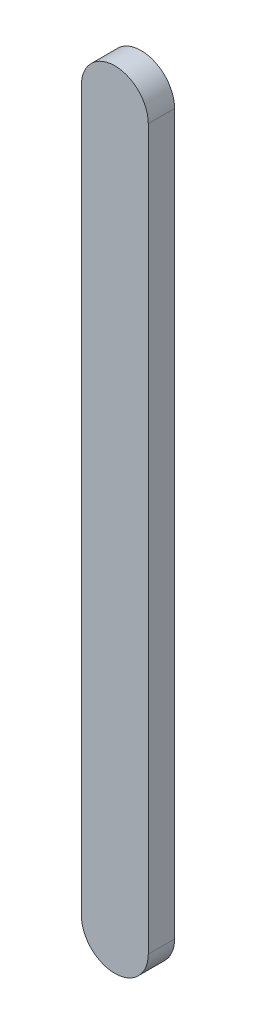
ISO-10303-21;
HEADER;
FILE_DESCRIPTION(('STEP AP214'),'2;1');
FILE_NAME('part.step','',(''),(''),'','','');
FILE_SCHEMA(('AUTOMOTIVE_DESIGN { 1 0 10303 214 1 1 1 1 }'));
ENDSEC;
DATA;
#1=APPLICATION_CONTEXT('core data for automotive mechanical design processes');
#2=APPLICATION_PROTOCOL_DEFINITION('international standard','automotive_design',2000,#1);
#3=PRODUCT_CONTEXT('',#1,'mechanical');
#4=PRODUCT('Part','Part','',(#3));
#5=PRODUCT_RELATED_PRODUCT_CATEGORY('part','',(#4));
#6=PRODUCT_DEFINITION_FORMATION('','',#4);
#7=PRODUCT_DEFINITION_CONTEXT('part definition',#1,'design');
#8=PRODUCT_DEFINITION('design','',#6,#7);
#9=PRODUCT_DEFINITION_SHAPE('','',#8);
#10=(LENGTH_UNIT() NAMED_UNIT(*) SI_UNIT(.MILLI.,.METRE.));
#11=(NAMED_UNIT(*) PLANE_ANGLE_UNIT() SI_UNIT($,.RADIAN.));
#12=(NAMED_UNIT(*) SI_UNIT($,.STERADIAN.) SOLID_ANGLE_UNIT());
#13=UNCERTAINTY_MEASURE_WITH_UNIT(LENGTH_MEASURE(1.E-05),#10,'distance_accuracy_value','');
#14=(GEOMETRIC_REPRESENTATION_CONTEXT(3) GLOBAL_UNCERTAINTY_ASSIGNED_CONTEXT((#13)) GLOBAL_UNIT_ASSIGNED_CONTEXT((#10,
#11,#12)) REPRESENTATION_CONTEXT('',''));
#15=CARTESIAN_POINT('',(0.,0.,0.));
#16=DIRECTION('',(0.,0.,1.));
#17=DIRECTION('',(1.,0.,0.));
#18=AXIS2_PLACEMENT_3D('',#15,#16,#17);
#19=CARTESIAN_POINT('',(151.638,98.4220028,0.));
#20=DIRECTION('',(-1.,0.,0.));
#21=DIRECTION('',(0.,1.,0.));
#22=AXIS2_PLACEMENT_3D('',#19,#20,#21);
#23=PLANE('',#22);
#24=DIRECTION('',(0.,1.,0.));
#25=VECTOR('',#24,1.);
#26=CARTESIAN_POINT('',(151.638,98.4220028,0.1999996));
#27=LINE('',#26,#25);
#28=CARTESIAN_POINT('',(151.638,98.4220028,0.1999996));
#29=VERTEX_POINT('',#28);
#30=CARTESIAN_POINT('',(151.638,103.886,0.1999996));
#31=VERTEX_POINT('',#30);
#32=EDGE_CURVE('E11',#29,#31,#27,.T.);
#33=ORIENTED_EDGE('',*,*,#32,.F.);
#34=DIRECTION('',(0.,0.,1.));
#35=VECTOR('',#34,1.);
#36=CARTESIAN_POINT('',(151.638,98.4220028,0.));
#37=LINE('',#36,#35);
#38=CARTESIAN_POINT('',(151.638,98.4220028,0.));
#39=VERTEX_POINT('',#38);
#40=EDGE_CURVE('E24',#39,#29,#37,.T.);
#41=ORIENTED_EDGE('',*,*,#40,.F.);
#42=DIRECTION('',(0.,1.,0.));
#43=VECTOR('',#42,1.);
#44=CARTESIAN_POINT('',(151.638,98.4220028,0.));
#45=LINE('',#44,#43);
#46=CARTESIAN_POINT('',(151.638,103.886,0.));
#47=VERTEX_POINT('',#46);
#48=EDGE_CURVE('E75',#39,#47,#45,.T.);
#49=ORIENTED_EDGE('',*,*,#48,.T.);
#50=DIRECTION('',(0.,0.,1.));
#51=VECTOR('',#50,1.);
#52=CARTESIAN_POINT('',(151.638,103.886,0.));
#53=LINE('',#52,#51);
#54=EDGE_CURVE('E37',#47,#31,#53,.T.);
#55=ORIENTED_EDGE('',*,*,#54,.T.);
#56=EDGE_LOOP('',(#33,#41,#49,#55));
#57=FACE_BOUND('',#56,.T.);
#58=ADVANCED_FACE('F17',(#57),#23,.F.);
#59=CARTESIAN_POINT('',(151.384,103.886,0.));
#60=DIRECTION('',(0.,0.,-1.));
#61=DIRECTION('',(1.,0.,0.));
#62=AXIS2_PLACEMENT_3D('',#59,#60,#61);
#63=CYLINDRICAL_SURFACE('',#62,0.254);
#64=CARTESIAN_POINT('',(151.384,103.886,0.1999996));
#65=DIRECTION('',(0.,0.,1.));
#66=DIRECTION('',(1.,0.,0.));
#67=AXIS2_PLACEMENT_3D('',#64,#65,#66);
#68=CIRCLE('',#67,0.254);
#69=CARTESIAN_POINT('',(151.13,103.886,0.1999996));
#70=VERTEX_POINT('',#69);
#71=EDGE_CURVE('E83',#31,#70,#68,.T.);
#72=ORIENTED_EDGE('',*,*,#71,.F.);
#73=ORIENTED_EDGE('',*,*,#54,.F.);
#74=CARTESIAN_POINT('',(151.384,103.886,0.));
#75=DIRECTION('',(0.,0.,1.));
#76=DIRECTION('',(1.,0.,0.));
#77=AXIS2_PLACEMENT_3D('',#74,#75,#76);
#78=CIRCLE('',#77,0.254);
#79=CARTESIAN_POINT('',(151.13,103.886,0.));
#80=VERTEX_POINT('',#79);
#81=EDGE_CURVE('E81',#47,#80,#78,.T.);
#82=ORIENTED_EDGE('',*,*,#81,.T.);
#83=DIRECTION('',(0.,0.,1.));
#84=VECTOR('',#83,1.);
#85=CARTESIAN_POINT('',(151.13,103.886,0.));
#86=LINE('',#85,#84);
#87=EDGE_CURVE('E67',#80,#70,#86,.T.);
#88=ORIENTED_EDGE('',*,*,#87,.T.);
#89=EDGE_LOOP('',(#72,#73,#82,#88));
#90=FACE_BOUND('',#89,.T.);
#91=ADVANCED_FACE('F89',(#90),#63,.T.);
#92=CARTESIAN_POINT('',(151.13,103.886,0.));
#93=DIRECTION('',(1.,0.,0.));
#94=DIRECTION('',(0.,-1.,0.));
#95=AXIS2_PLACEMENT_3D('',#92,#93,#94);
#96=PLANE('',#95);
#97=DIRECTION('',(0.,-1.,0.));
#98=VECTOR('',#97,1.);
#99=CARTESIAN_POINT('',(151.13,103.886,0.1999996));
#100=LINE('',#99,#98);
#101=CARTESIAN_POINT('',(151.13,98.4220028,0.1999996));
#102=VERTEX_POINT('',#101);
#103=EDGE_CURVE('E71',#70,#102,#100,.T.);
#104=ORIENTED_EDGE('',*,*,#103,.F.);
#105=ORIENTED_EDGE('',*,*,#87,.F.);
#106=DIRECTION('',(0.,-1.,0.));
#107=VECTOR('',#106,1.);
#108=CARTESIAN_POINT('',(151.13,103.886,0.));
#109=LINE('',#108,#107);
#110=CARTESIAN_POINT('',(151.13,98.4220028,0.));
#111=VERTEX_POINT('',#110);
#112=EDGE_CURVE('E63',#80,#111,#109,.T.);
#113=ORIENTED_EDGE('',*,*,#112,.T.);
#114=DIRECTION('',(0.,0.,1.));
#115=VECTOR('',#114,1.);
#116=CARTESIAN_POINT('',(151.13,98.4220028,0.));
#117=LINE('',#116,#115);
#118=EDGE_CURVE('E53',#111,#102,#117,.T.);
#119=ORIENTED_EDGE('',*,*,#118,.T.);
#120=EDGE_LOOP('',(#104,#105,#113,#119));
#121=FACE_BOUND('',#120,.T.);
#122=ADVANCED_FACE('F66',(#121),#96,.F.);
#123=CARTESIAN_POINT('',(151.384,98.4220028,0.));
#124=DIRECTION('',(0.,0.,-1.));
#125=DIRECTION('',(-1.,0.,0.));
#126=AXIS2_PLACEMENT_3D('',#123,#124,#125);
#127=CYLINDRICAL_SURFACE('',#126,0.254000000000005);
#128=CARTESIAN_POINT('',(151.384,98.4220028,0.1999996));
#129=DIRECTION('',(0.,0.,1.));
#130=DIRECTION('',(-1.,0.,0.));
#131=AXIS2_PLACEMENT_3D('',#128,#129,#130);
#132=CIRCLE('',#131,0.254000000000005);
#133=EDGE_CURVE('E59',#102,#29,#132,.T.);
#134=ORIENTED_EDGE('',*,*,#133,.F.);
#135=ORIENTED_EDGE('',*,*,#118,.F.);
#136=CARTESIAN_POINT('',(151.384,98.4220028,0.));
#137=DIRECTION('',(0.,0.,1.));
#138=DIRECTION('',(-1.,0.,0.));
#139=AXIS2_PLACEMENT_3D('',#136,#137,#138);
#140=CIRCLE('',#139,0.254000000000005);
#141=EDGE_CURVE('E57',#111,#39,#140,.T.);
#142=ORIENTED_EDGE('',*,*,#141,.T.);
#143=ORIENTED_EDGE('',*,*,#40,.T.);
#144=EDGE_LOOP('',(#134,#135,#142,#143));
#145=FACE_BOUND('',#144,.T.);
#146=ADVANCED_FACE('F55',(#145),#127,.T.);
#147=CARTESIAN_POINT('',(151.638,98.4220028,0.));
#148=DIRECTION('',(0.,0.,-1.));
#149=DIRECTION('',(-1.,0.,0.));
#150=AXIS2_PLACEMENT_3D('',#147,#148,#149);
#151=PLANE('',#150);
#152=ORIENTED_EDGE('',*,*,#141,.F.);
#153=ORIENTED_EDGE('',*,*,#112,.F.);
#154=ORIENTED_EDGE('',*,*,#81,.F.);
#155=ORIENTED_EDGE('',*,*,#48,.F.);
#156=EDGE_LOOP('',(#152,#153,#154,#155));
#157=FACE_BOUND('',#156,.T.);
#158=ADVANCED_FACE('F74',(#157),#151,.T.);
#159=CARTESIAN_POINT('',(151.638,98.4220028,0.1999996));
#160=DIRECTION('',(0.,0.,-1.));
#161=DIRECTION('',(-1.,0.,0.));
#162=AXIS2_PLACEMENT_3D('',#159,#160,#161);
#163=PLANE('',#162);
#164=ORIENTED_EDGE('',*,*,#32,.T.);
#165=ORIENTED_EDGE('',*,*,#71,.T.);
#166=ORIENTED_EDGE('',*,*,#103,.T.);
#167=ORIENTED_EDGE('',*,*,#133,.T.);
#168=EDGE_LOOP('',(#164,#165,#166,#167));
#169=FACE_BOUND('',#168,.T.);
#170=ADVANCED_FACE('F91',(#169),#163,.F.);
#171=CLOSED_SHELL('',(#58,#91,#122,#146,#158,#170));
#172=MANIFOLD_SOLID_BREP('B1',#171);
#173=ADVANCED_BREP_SHAPE_REPRESENTATION('',(#18,#172),#14);
#174=SHAPE_DEFINITION_REPRESENTATION(#9,#173);
ENDSEC;
END-ISO-10303-21;
